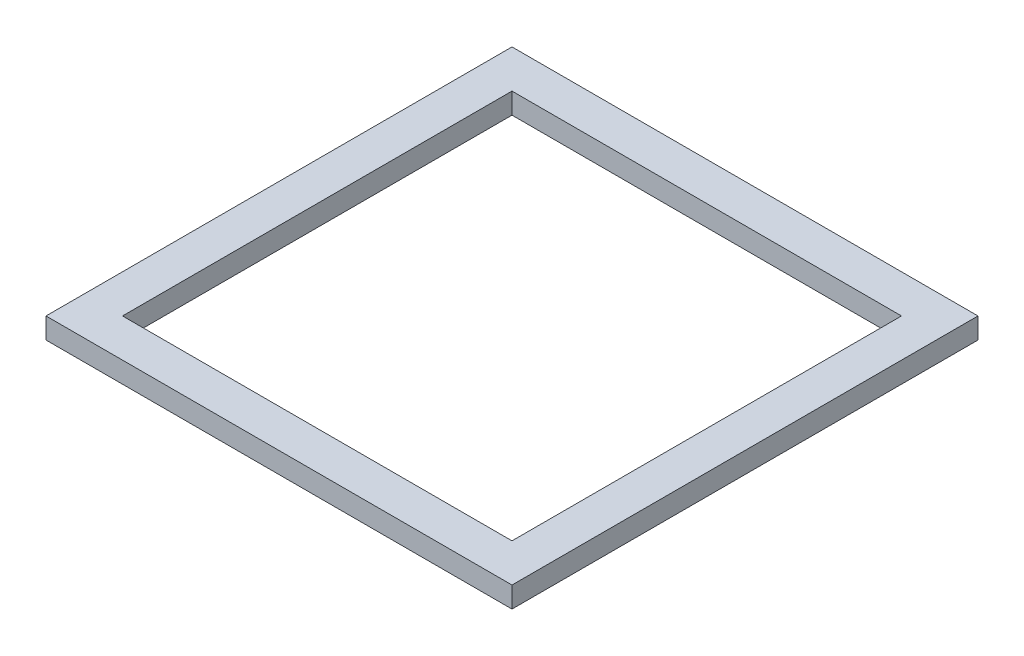
ISO-10303-21;
HEADER;
FILE_DESCRIPTION(('STEP AP214'),'2;1');
FILE_NAME('part.step','',(''),(''),'','','');
FILE_SCHEMA(('AUTOMOTIVE_DESIGN { 1 0 10303 214 1 1 1 1 }'));
ENDSEC;
DATA;
#1=APPLICATION_CONTEXT('core data for automotive mechanical design processes');
#2=APPLICATION_PROTOCOL_DEFINITION('international standard','automotive_design',2000,#1);
#3=PRODUCT_CONTEXT('',#1,'mechanical');
#4=PRODUCT('Part','Part','',(#3));
#5=PRODUCT_RELATED_PRODUCT_CATEGORY('part','',(#4));
#6=PRODUCT_DEFINITION_FORMATION('','',#4);
#7=PRODUCT_DEFINITION_CONTEXT('part definition',#1,'design');
#8=PRODUCT_DEFINITION('design','',#6,#7);
#9=PRODUCT_DEFINITION_SHAPE('','',#8);
#10=(LENGTH_UNIT() NAMED_UNIT(*) SI_UNIT(.MILLI.,.METRE.));
#11=(NAMED_UNIT(*) PLANE_ANGLE_UNIT() SI_UNIT($,.RADIAN.));
#12=(NAMED_UNIT(*) SI_UNIT($,.STERADIAN.) SOLID_ANGLE_UNIT());
#13=UNCERTAINTY_MEASURE_WITH_UNIT(LENGTH_MEASURE(1.E-05),#10,'distance_accuracy_value','');
#14=(GEOMETRIC_REPRESENTATION_CONTEXT(3) GLOBAL_UNCERTAINTY_ASSIGNED_CONTEXT((#13)) GLOBAL_UNIT_ASSIGNED_CONTEXT((#10,
#11,#12)) REPRESENTATION_CONTEXT('',''));
#15=CARTESIAN_POINT('',(0.,0.,0.));
#16=DIRECTION('',(0.,0.,1.));
#17=DIRECTION('',(1.,0.,0.));
#18=AXIS2_PLACEMENT_3D('',#15,#16,#17);
#19=CARTESIAN_POINT('',(0.,19.05,0.));
#20=DIRECTION('',(0.,1.,0.));
#21=DIRECTION('',(0.,0.,1.));
#22=AXIS2_PLACEMENT_3D('',#19,#20,#21);
#23=PLANE('',#22);
#24=DIRECTION('',(0.,0.,1.));
#25=VECTOR('',#24,1.);
#26=CARTESIAN_POINT('',(-235.004469932611,19.05,324.758715484813));
#27=LINE('',#26,#25);
#28=CARTESIAN_POINT('',(-235.004469932611,19.05,324.758715484813));
#29=VERTEX_POINT('',#28);
#30=CARTESIAN_POINT('',(-235.004469932611,19.05,750.208715484814));
#31=VERTEX_POINT('',#30);
#32=EDGE_CURVE('E145',#29,#31,#27,.T.);
#33=ORIENTED_EDGE('',*,*,#32,.T.);
#34=DIRECTION('',(1.,0.,0.));
#35=VECTOR('',#34,1.);
#36=CARTESIAN_POINT('',(-235.004469932611,19.05,750.208715484814));
#37=LINE('',#36,#35);
#38=CARTESIAN_POINT('',(190.445530067389,19.05,750.208715484814));
#39=VERTEX_POINT('',#38);
#40=EDGE_CURVE('E149',#31,#39,#37,.T.);
#41=ORIENTED_EDGE('',*,*,#40,.T.);
#42=DIRECTION('',(0.,0.,-1.));
#43=VECTOR('',#42,1.);
#44=CARTESIAN_POINT('',(190.445530067389,19.05,324.758715484813));
#45=LINE('',#44,#43);
#46=CARTESIAN_POINT('',(190.445530067389,19.05,324.758715484813));
#47=VERTEX_POINT('',#46);
#48=EDGE_CURVE('E153',#39,#47,#45,.T.);
#49=ORIENTED_EDGE('',*,*,#48,.T.);
#50=DIRECTION('',(-1.,0.,0.));
#51=VECTOR('',#50,1.);
#52=CARTESIAN_POINT('',(-235.004469932611,19.05,324.758715484813));
#53=LINE('',#52,#51);
#54=EDGE_CURVE('E156',#47,#29,#53,.T.);
#55=ORIENTED_EDGE('',*,*,#54,.T.);
#56=EDGE_LOOP('',(#33,#41,#49,#55));
#57=FACE_BOUND('',#56,.T.);
#58=DIRECTION('',(1.,0.,0.));
#59=VECTOR('',#58,1.);
#60=CARTESIAN_POINT('',(-200.079469932611,19.05,715.283715484813));
#61=LINE('',#60,#59);
#62=CARTESIAN_POINT('',(-200.079469932611,19.05,715.283715484813));
#63=VERTEX_POINT('',#62);
#64=CARTESIAN_POINT('',(155.520530067389,19.05,715.283715484813));
#65=VERTEX_POINT('',#64);
#66=EDGE_CURVE('E109',#63,#65,#61,.T.);
#67=ORIENTED_EDGE('',*,*,#66,.F.);
#68=DIRECTION('',(0.,0.,1.));
#69=VECTOR('',#68,1.);
#70=CARTESIAN_POINT('',(-200.079469932611,19.05,359.683715484813));
#71=LINE('',#70,#69);
#72=CARTESIAN_POINT('',(-200.079469932611,19.05,359.683715484813));
#73=VERTEX_POINT('',#72);
#74=EDGE_CURVE('E100',#73,#63,#71,.T.);
#75=ORIENTED_EDGE('',*,*,#74,.F.);
#76=DIRECTION('',(-1.,0.,0.));
#77=VECTOR('',#76,1.);
#78=CARTESIAN_POINT('',(-200.079469932611,19.05,359.683715484813));
#79=LINE('',#78,#77);
#80=CARTESIAN_POINT('',(155.520530067389,19.05,359.683715484813));
#81=VERTEX_POINT('',#80);
#82=EDGE_CURVE('E128',#81,#73,#79,.T.);
#83=ORIENTED_EDGE('',*,*,#82,.F.);
#84=DIRECTION('',(0.,0.,-1.));
#85=VECTOR('',#84,1.);
#86=CARTESIAN_POINT('',(155.520530067389,19.05,359.683715484813));
#87=LINE('',#86,#85);
#88=EDGE_CURVE('E121',#65,#81,#87,.T.);
#89=ORIENTED_EDGE('',*,*,#88,.F.);
#90=EDGE_LOOP('',(#67,#75,#83,#89));
#91=FACE_BOUND('',#90,.T.);
#92=ADVANCED_FACE('F34',(#57,#91),#23,.T.);
#93=CARTESIAN_POINT('',(0.,0.,0.));
#94=DIRECTION('',(0.,1.,0.));
#95=DIRECTION('',(0.,0.,1.));
#96=AXIS2_PLACEMENT_3D('',#93,#94,#95);
#97=PLANE('',#96);
#98=DIRECTION('',(0.,0.,1.));
#99=VECTOR('',#98,1.);
#100=CARTESIAN_POINT('',(-235.004469932611,0.,324.758715484813));
#101=LINE('',#100,#99);
#102=CARTESIAN_POINT('',(-235.004469932611,0.,324.758715484813));
#103=VERTEX_POINT('',#102);
#104=CARTESIAN_POINT('',(-235.004469932611,0.,750.208715484814));
#105=VERTEX_POINT('',#104);
#106=EDGE_CURVE('E117',#103,#105,#101,.T.);
#107=ORIENTED_EDGE('',*,*,#106,.F.);
#108=DIRECTION('',(-1.,0.,0.));
#109=VECTOR('',#108,1.);
#110=CARTESIAN_POINT('',(-235.004469932611,0.,324.758715484813));
#111=LINE('',#110,#109);
#112=CARTESIAN_POINT('',(190.445530067389,0.,324.758715484813));
#113=VERTEX_POINT('',#112);
#114=EDGE_CURVE('E150',#113,#103,#111,.T.);
#115=ORIENTED_EDGE('',*,*,#114,.F.);
#116=DIRECTION('',(0.,0.,-1.));
#117=VECTOR('',#116,1.);
#118=CARTESIAN_POINT('',(190.445530067389,0.,324.758715484813));
#119=LINE('',#118,#117);
#120=CARTESIAN_POINT('',(190.445530067389,0.,750.208715484814));
#121=VERTEX_POINT('',#120);
#122=EDGE_CURVE('E163',#121,#113,#119,.T.);
#123=ORIENTED_EDGE('',*,*,#122,.F.);
#124=DIRECTION('',(1.,0.,0.));
#125=VECTOR('',#124,1.);
#126=CARTESIAN_POINT('',(-235.004469932611,0.,750.208715484814));
#127=LINE('',#126,#125);
#128=EDGE_CURVE('E161',#105,#121,#127,.T.);
#129=ORIENTED_EDGE('',*,*,#128,.F.);
#130=EDGE_LOOP('',(#107,#115,#123,#129));
#131=FACE_BOUND('',#130,.T.);
#132=DIRECTION('',(0.,0.,1.));
#133=VECTOR('',#132,1.);
#134=CARTESIAN_POINT('',(-200.079469932611,0.,359.683715484813));
#135=LINE('',#134,#133);
#136=CARTESIAN_POINT('',(-200.079469932611,0.,359.683715484813));
#137=VERTEX_POINT('',#136);
#138=CARTESIAN_POINT('',(-200.079469932611,0.,715.283715484813));
#139=VERTEX_POINT('',#138);
#140=EDGE_CURVE('E58',#137,#139,#135,.T.);
#141=ORIENTED_EDGE('',*,*,#140,.T.);
#142=DIRECTION('',(1.,0.,0.));
#143=VECTOR('',#142,1.);
#144=CARTESIAN_POINT('',(-200.079469932611,0.,715.283715484813));
#145=LINE('',#144,#143);
#146=CARTESIAN_POINT('',(155.520530067389,0.,715.283715484813));
#147=VERTEX_POINT('',#146);
#148=EDGE_CURVE('E116',#139,#147,#145,.T.);
#149=ORIENTED_EDGE('',*,*,#148,.T.);
#150=DIRECTION('',(0.,0.,-1.));
#151=VECTOR('',#150,1.);
#152=CARTESIAN_POINT('',(155.520530067389,0.,359.683715484813));
#153=LINE('',#152,#151);
#154=CARTESIAN_POINT('',(155.520530067389,0.,359.683715484813));
#155=VERTEX_POINT('',#154);
#156=EDGE_CURVE('E135',#147,#155,#153,.T.);
#157=ORIENTED_EDGE('',*,*,#156,.T.);
#158=DIRECTION('',(-1.,0.,0.));
#159=VECTOR('',#158,1.);
#160=CARTESIAN_POINT('',(-200.079469932611,0.,359.683715484813));
#161=LINE('',#160,#159);
#162=EDGE_CURVE('E110',#155,#137,#161,.T.);
#163=ORIENTED_EDGE('',*,*,#162,.T.);
#164=EDGE_LOOP('',(#141,#149,#157,#163));
#165=FACE_BOUND('',#164,.T.);
#166=ADVANCED_FACE('F183',(#131,#165),#97,.F.);
#167=CARTESIAN_POINT('',(-235.004469932611,19.05,324.758715484813));
#168=DIRECTION('',(1.,0.,0.));
#169=DIRECTION('',(0.,0.,-1.));
#170=AXIS2_PLACEMENT_3D('',#167,#168,#169);
#171=PLANE('',#170);
#172=ORIENTED_EDGE('',*,*,#106,.T.);
#173=DIRECTION('',(0.,-1.,0.));
#174=VECTOR('',#173,1.);
#175=CARTESIAN_POINT('',(-235.004469932611,19.05,750.208715484814));
#176=LINE('',#175,#174);
#177=EDGE_CURVE('E11',#31,#105,#176,.T.);
#178=ORIENTED_EDGE('',*,*,#177,.F.);
#179=ORIENTED_EDGE('',*,*,#32,.F.);
#180=DIRECTION('',(0.,-1.,0.));
#181=VECTOR('',#180,1.);
#182=CARTESIAN_POINT('',(-235.004469932611,19.05,324.758715484813));
#183=LINE('',#182,#181);
#184=EDGE_CURVE('E158',#29,#103,#183,.T.);
#185=ORIENTED_EDGE('',*,*,#184,.T.);
#186=EDGE_LOOP('',(#172,#178,#179,#185));
#187=FACE_BOUND('',#186,.T.);
#188=ADVANCED_FACE('F36',(#187),#171,.F.);
#189=CARTESIAN_POINT('',(-235.004469932611,19.05,750.208715484814));
#190=DIRECTION('',(0.,0.,-1.));
#191=DIRECTION('',(-1.,0.,0.));
#192=AXIS2_PLACEMENT_3D('',#189,#190,#191);
#193=PLANE('',#192);
#194=ORIENTED_EDGE('',*,*,#128,.T.);
#195=DIRECTION('',(0.,-1.,0.));
#196=VECTOR('',#195,1.);
#197=CARTESIAN_POINT('',(190.445530067389,19.05,750.208715484814));
#198=LINE('',#197,#196);
#199=EDGE_CURVE('E43',#39,#121,#198,.T.);
#200=ORIENTED_EDGE('',*,*,#199,.F.);
#201=ORIENTED_EDGE('',*,*,#40,.F.);
#202=ORIENTED_EDGE('',*,*,#177,.T.);
#203=EDGE_LOOP('',(#194,#200,#201,#202));
#204=FACE_BOUND('',#203,.T.);
#205=ADVANCED_FACE('F193',(#204),#193,.F.);
#206=CARTESIAN_POINT('',(190.445530067389,19.05,324.758715484813));
#207=DIRECTION('',(-1.,0.,0.));
#208=DIRECTION('',(0.,0.,1.));
#209=AXIS2_PLACEMENT_3D('',#206,#207,#208);
#210=PLANE('',#209);
#211=ORIENTED_EDGE('',*,*,#122,.T.);
#212=DIRECTION('',(0.,-1.,0.));
#213=VECTOR('',#212,1.);
#214=CARTESIAN_POINT('',(190.445530067389,19.05,324.758715484813));
#215=LINE('',#214,#213);
#216=EDGE_CURVE('E170',#47,#113,#215,.T.);
#217=ORIENTED_EDGE('',*,*,#216,.F.);
#218=ORIENTED_EDGE('',*,*,#48,.F.);
#219=ORIENTED_EDGE('',*,*,#199,.T.);
#220=EDGE_LOOP('',(#211,#217,#218,#219));
#221=FACE_BOUND('',#220,.T.);
#222=ADVANCED_FACE('F177',(#221),#210,.F.);
#223=CARTESIAN_POINT('',(-235.004469932611,19.05,324.758715484813));
#224=DIRECTION('',(0.,0.,1.));
#225=DIRECTION('',(1.,0.,0.));
#226=AXIS2_PLACEMENT_3D('',#223,#224,#225);
#227=PLANE('',#226);
#228=ORIENTED_EDGE('',*,*,#114,.T.);
#229=ORIENTED_EDGE('',*,*,#184,.F.);
#230=ORIENTED_EDGE('',*,*,#54,.F.);
#231=ORIENTED_EDGE('',*,*,#216,.T.);
#232=EDGE_LOOP('',(#228,#229,#230,#231));
#233=FACE_BOUND('',#232,.T.);
#234=ADVANCED_FACE('F187',(#233),#227,.F.);
#235=CARTESIAN_POINT('',(-200.079469932611,19.05,359.683715484813));
#236=DIRECTION('',(1.,0.,0.));
#237=DIRECTION('',(0.,0.,-1.));
#238=AXIS2_PLACEMENT_3D('',#235,#236,#237);
#239=PLANE('',#238);
#240=ORIENTED_EDGE('',*,*,#140,.F.);
#241=DIRECTION('',(0.,-1.,0.));
#242=VECTOR('',#241,1.);
#243=CARTESIAN_POINT('',(-200.079469932611,19.05,359.683715484813));
#244=LINE('',#243,#242);
#245=EDGE_CURVE('E104',#73,#137,#244,.T.);
#246=ORIENTED_EDGE('',*,*,#245,.F.);
#247=ORIENTED_EDGE('',*,*,#74,.T.);
#248=DIRECTION('',(0.,-1.,0.));
#249=VECTOR('',#248,1.);
#250=CARTESIAN_POINT('',(-200.079469932611,19.05,715.283715484813));
#251=LINE('',#250,#249);
#252=EDGE_CURVE('E103',#63,#139,#251,.T.);
#253=ORIENTED_EDGE('',*,*,#252,.T.);
#254=EDGE_LOOP('',(#240,#246,#247,#253));
#255=FACE_BOUND('',#254,.T.);
#256=ADVANCED_FACE('F102',(#255),#239,.T.);
#257=CARTESIAN_POINT('',(-200.079469932611,19.05,715.283715484813));
#258=DIRECTION('',(0.,0.,-1.));
#259=DIRECTION('',(-1.,0.,0.));
#260=AXIS2_PLACEMENT_3D('',#257,#258,#259);
#261=PLANE('',#260);
#262=ORIENTED_EDGE('',*,*,#148,.F.);
#263=ORIENTED_EDGE('',*,*,#252,.F.);
#264=ORIENTED_EDGE('',*,*,#66,.T.);
#265=DIRECTION('',(0.,-1.,0.));
#266=VECTOR('',#265,1.);
#267=CARTESIAN_POINT('',(155.520530067389,19.05,715.283715484813));
#268=LINE('',#267,#266);
#269=EDGE_CURVE('E118',#65,#147,#268,.T.);
#270=ORIENTED_EDGE('',*,*,#269,.T.);
#271=EDGE_LOOP('',(#262,#263,#264,#270));
#272=FACE_BOUND('',#271,.T.);
#273=ADVANCED_FACE('F113',(#272),#261,.T.);
#274=CARTESIAN_POINT('',(155.520530067389,19.05,359.683715484813));
#275=DIRECTION('',(-1.,0.,0.));
#276=DIRECTION('',(0.,0.,1.));
#277=AXIS2_PLACEMENT_3D('',#274,#275,#276);
#278=PLANE('',#277);
#279=ORIENTED_EDGE('',*,*,#156,.F.);
#280=ORIENTED_EDGE('',*,*,#269,.F.);
#281=ORIENTED_EDGE('',*,*,#88,.T.);
#282=DIRECTION('',(0.,-1.,0.));
#283=VECTOR('',#282,1.);
#284=CARTESIAN_POINT('',(155.520530067389,19.05,359.683715484813));
#285=LINE('',#284,#283);
#286=EDGE_CURVE('E50',#81,#155,#285,.T.);
#287=ORIENTED_EDGE('',*,*,#286,.T.);
#288=EDGE_LOOP('',(#279,#280,#281,#287));
#289=FACE_BOUND('',#288,.T.);
#290=ADVANCED_FACE('F216',(#289),#278,.T.);
#291=CARTESIAN_POINT('',(-200.079469932611,19.05,359.683715484813));
#292=DIRECTION('',(0.,0.,1.));
#293=DIRECTION('',(1.,0.,0.));
#294=AXIS2_PLACEMENT_3D('',#291,#292,#293);
#295=PLANE('',#294);
#296=ORIENTED_EDGE('',*,*,#162,.F.);
#297=ORIENTED_EDGE('',*,*,#286,.F.);
#298=ORIENTED_EDGE('',*,*,#82,.T.);
#299=ORIENTED_EDGE('',*,*,#245,.T.);
#300=EDGE_LOOP('',(#296,#297,#298,#299));
#301=FACE_BOUND('',#300,.T.);
#302=ADVANCED_FACE('F220',(#301),#295,.T.);
#303=CLOSED_SHELL('',(#92,#166,#188,#205,#222,#234,#256,#273,#290,#302));
#304=MANIFOLD_SOLID_BREP('B2',#303);
#305=ADVANCED_BREP_SHAPE_REPRESENTATION('',(#18,#304),#14);
#306=SHAPE_DEFINITION_REPRESENTATION(#9,#305);
ENDSEC;
END-ISO-10303-21;
